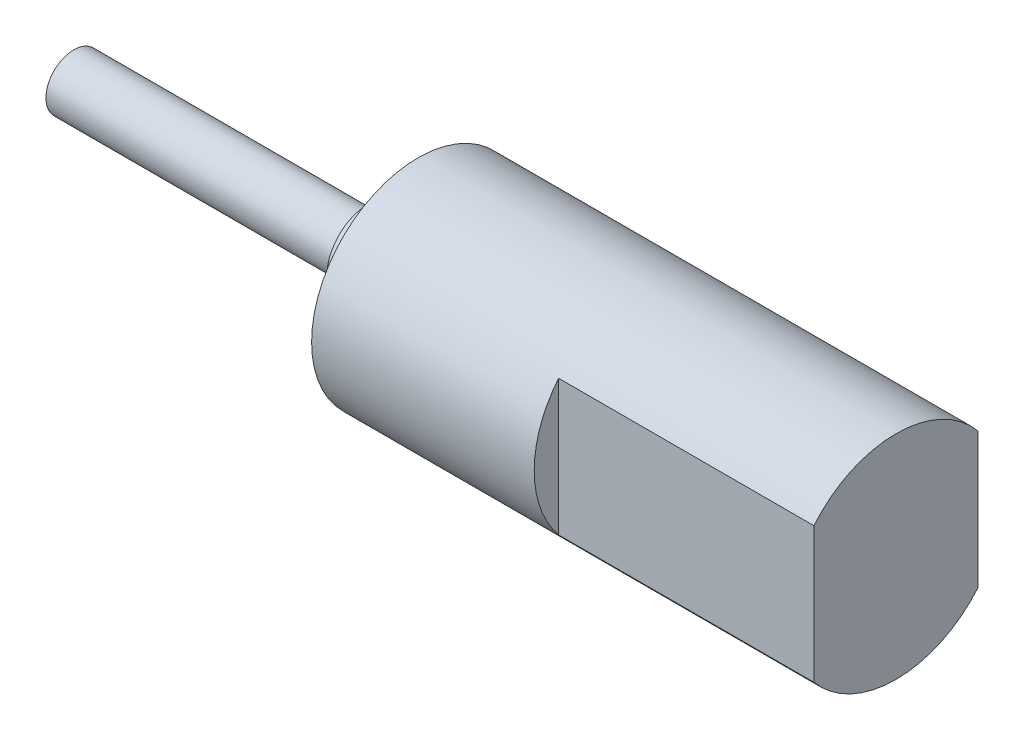
ISO-10303-21;
HEADER;
FILE_DESCRIPTION(('STEP AP214'),'2;1');
FILE_NAME('part.step','',(''),(''),'','','');
FILE_SCHEMA(('AUTOMOTIVE_DESIGN { 1 0 10303 214 1 1 1 1 }'));
ENDSEC;
DATA;
#1=APPLICATION_CONTEXT('core data for automotive mechanical design processes');
#2=APPLICATION_PROTOCOL_DEFINITION('international standard','automotive_design',2000,#1);
#3=PRODUCT_CONTEXT('',#1,'mechanical');
#4=PRODUCT('Part','Part','',(#3));
#5=PRODUCT_RELATED_PRODUCT_CATEGORY('part','',(#4));
#6=PRODUCT_DEFINITION_FORMATION('','',#4);
#7=PRODUCT_DEFINITION_CONTEXT('part definition',#1,'design');
#8=PRODUCT_DEFINITION('design','',#6,#7);
#9=PRODUCT_DEFINITION_SHAPE('','',#8);
#10=(LENGTH_UNIT() NAMED_UNIT(*) SI_UNIT(.MILLI.,.METRE.));
#11=(NAMED_UNIT(*) PLANE_ANGLE_UNIT() SI_UNIT($,.RADIAN.));
#12=(NAMED_UNIT(*) SI_UNIT($,.STERADIAN.) SOLID_ANGLE_UNIT());
#13=UNCERTAINTY_MEASURE_WITH_UNIT(LENGTH_MEASURE(1.E-05),#10,'distance_accuracy_value','');
#14=(GEOMETRIC_REPRESENTATION_CONTEXT(3) GLOBAL_UNCERTAINTY_ASSIGNED_CONTEXT((#13)) GLOBAL_UNIT_ASSIGNED_CONTEXT((#10,
#11,#12)) REPRESENTATION_CONTEXT('',''));
#15=CARTESIAN_POINT('',(0.,0.,0.));
#16=DIRECTION('',(0.,0.,1.));
#17=DIRECTION('',(1.,0.,0.));
#18=AXIS2_PLACEMENT_3D('',#15,#16,#17);
#19=CARTESIAN_POINT('',(-40.77,0.,0.));
#20=DIRECTION('',(1.,0.,0.));
#21=DIRECTION('',(0.,0.,-1.));
#22=AXIS2_PLACEMENT_3D('',#19,#20,#21);
#23=CYLINDRICAL_SURFACE('',#22,2.);
#24=DIRECTION('',(-1.,0.,0.));
#25=VECTOR('',#24,1.);
#26=CARTESIAN_POINT('',(-19.57,1.3228756555323,-1.5));
#27=LINE('',#26,#25);
#28=CARTESIAN_POINT('',(-19.57,1.3228756555323,-1.5));
#29=VERTEX_POINT('',#28);
#30=CARTESIAN_POINT('',(-40.77,1.3228756555323,-1.5));
#31=VERTEX_POINT('',#30);
#32=EDGE_CURVE('E161',#29,#31,#27,.T.);
#33=ORIENTED_EDGE('',*,*,#32,.T.);
#34=CARTESIAN_POINT('',(-40.77,0.,0.));
#35=DIRECTION('',(-1.,0.,0.));
#36=DIRECTION('',(0.,0.,1.));
#37=AXIS2_PLACEMENT_3D('',#34,#35,#36);
#38=CIRCLE('',#37,2.);
#39=CARTESIAN_POINT('',(-40.77,-1.3228756555323,-1.5));
#40=VERTEX_POINT('',#39);
#41=EDGE_CURVE('E156',#40,#31,#38,.T.);
#42=ORIENTED_EDGE('',*,*,#41,.F.);
#43=DIRECTION('',(-1.,0.,0.));
#44=VECTOR('',#43,1.);
#45=CARTESIAN_POINT('',(-19.57,-1.3228756555323,-1.5));
#46=LINE('',#45,#44);
#47=CARTESIAN_POINT('',(-19.57,-1.3228756555323,-1.5));
#48=VERTEX_POINT('',#47);
#49=EDGE_CURVE('E65',#48,#40,#46,.T.);
#50=ORIENTED_EDGE('',*,*,#49,.F.);
#51=CARTESIAN_POINT('',(-19.57,0.,0.));
#52=DIRECTION('',(-1.,0.,0.));
#53=DIRECTION('',(0.,0.,1.));
#54=AXIS2_PLACEMENT_3D('',#51,#52,#53);
#55=CIRCLE('',#54,2.);
#56=EDGE_CURVE('E11',#48,#29,#55,.T.);
#57=ORIENTED_EDGE('',*,*,#56,.T.);
#58=EDGE_LOOP('',(#33,#42,#50,#57));
#59=FACE_BOUND('',#58,.T.);
#60=ADVANCED_FACE('F47',(#59),#23,.T.);
#61=CARTESIAN_POINT('',(-40.77,0.,0.));
#62=DIRECTION('',(-1.,0.,0.));
#63=DIRECTION('',(0.,0.,1.));
#64=AXIS2_PLACEMENT_3D('',#61,#62,#63);
#65=PLANE('',#64);
#66=ORIENTED_EDGE('',*,*,#41,.T.);
#67=DIRECTION('',(0.,-1.,0.));
#68=VECTOR('',#67,1.);
#69=CARTESIAN_POINT('',(-40.77,0.,-1.5));
#70=LINE('',#69,#68);
#71=EDGE_CURVE('E168',#31,#40,#70,.T.);
#72=ORIENTED_EDGE('',*,*,#71,.T.);
#73=EDGE_LOOP('',(#66,#72));
#74=FACE_BOUND('',#73,.T.);
#75=ADVANCED_FACE('F210',(#74),#65,.T.);
#76=CARTESIAN_POINT('',(18.36,0.,-5.9));
#77=DIRECTION('',(0.,0.,1.));
#78=DIRECTION('',(1.,0.,0.));
#79=AXIS2_PLACEMENT_3D('',#76,#77,#78);
#80=PLANE('',#79);
#81=DIRECTION('',(0.,1.,0.));
#82=VECTOR('',#81,1.);
#83=CARTESIAN_POINT('',(0.,0.,-5.9));
#84=LINE('',#83,#82);
#85=CARTESIAN_POINT('',(0.,-4.87739940952143,-5.9));
#86=VERTEX_POINT('',#85);
#87=CARTESIAN_POINT('',(0.,4.87739940952143,-5.9));
#88=VERTEX_POINT('',#87);
#89=EDGE_CURVE('E95',#86,#88,#84,.T.);
#90=ORIENTED_EDGE('',*,*,#89,.T.);
#91=DIRECTION('',(-1.,0.,0.));
#92=VECTOR('',#91,1.);
#93=CARTESIAN_POINT('',(18.36,4.87739940952143,-5.9));
#94=LINE('',#93,#92);
#95=CARTESIAN_POINT('',(18.36,4.87739940952143,-5.9));
#96=VERTEX_POINT('',#95);
#97=EDGE_CURVE('E51',#96,#88,#94,.T.);
#98=ORIENTED_EDGE('',*,*,#97,.F.);
#99=DIRECTION('',(0.,1.,0.));
#100=VECTOR('',#99,1.);
#101=CARTESIAN_POINT('',(18.36,0.,-5.9));
#102=LINE('',#101,#100);
#103=CARTESIAN_POINT('',(18.36,-4.87739940952143,-5.9));
#104=VERTEX_POINT('',#103);
#105=EDGE_CURVE('E109',#104,#96,#102,.T.);
#106=ORIENTED_EDGE('',*,*,#105,.F.);
#107=DIRECTION('',(-1.,0.,0.));
#108=VECTOR('',#107,1.);
#109=CARTESIAN_POINT('',(18.36,-4.87739940952143,-5.9));
#110=LINE('',#109,#108);
#111=EDGE_CURVE('E127',#104,#86,#110,.T.);
#112=ORIENTED_EDGE('',*,*,#111,.T.);
#113=EDGE_LOOP('',(#90,#98,#106,#112));
#114=FACE_BOUND('',#113,.T.);
#115=ADVANCED_FACE('F49',(#114),#80,.F.);
#116=CARTESIAN_POINT('',(18.36,0.,5.9));
#117=DIRECTION('',(0.,0.,-1.));
#118=DIRECTION('',(-1.,0.,0.));
#119=AXIS2_PLACEMENT_3D('',#116,#117,#118);
#120=PLANE('',#119);
#121=DIRECTION('',(0.,-1.,0.));
#122=VECTOR('',#121,1.);
#123=CARTESIAN_POINT('',(0.,0.,5.9));
#124=LINE('',#123,#122);
#125=CARTESIAN_POINT('',(0.,4.87739940952143,5.9));
#126=VERTEX_POINT('',#125);
#127=CARTESIAN_POINT('',(0.,-4.87739940952143,5.9));
#128=VERTEX_POINT('',#127);
#129=EDGE_CURVE('E133',#126,#128,#124,.T.);
#130=ORIENTED_EDGE('',*,*,#129,.T.);
#131=DIRECTION('',(-1.,0.,0.));
#132=VECTOR('',#131,1.);
#133=CARTESIAN_POINT('',(18.36,-4.87739940952143,5.9));
#134=LINE('',#133,#132);
#135=CARTESIAN_POINT('',(18.36,-4.87739940952143,5.9));
#136=VERTEX_POINT('',#135);
#137=EDGE_CURVE('E122',#136,#128,#134,.T.);
#138=ORIENTED_EDGE('',*,*,#137,.F.);
#139=DIRECTION('',(0.,-1.,0.));
#140=VECTOR('',#139,1.);
#141=CARTESIAN_POINT('',(18.36,0.,5.9));
#142=LINE('',#141,#140);
#143=CARTESIAN_POINT('',(18.36,4.87739940952143,5.9));
#144=VERTEX_POINT('',#143);
#145=EDGE_CURVE('E106',#144,#136,#142,.T.);
#146=ORIENTED_EDGE('',*,*,#145,.F.);
#147=DIRECTION('',(-1.,0.,0.));
#148=VECTOR('',#147,1.);
#149=CARTESIAN_POINT('',(18.36,4.87739940952143,5.9));
#150=LINE('',#149,#148);
#151=EDGE_CURVE('E116',#144,#126,#150,.T.);
#152=ORIENTED_EDGE('',*,*,#151,.T.);
#153=EDGE_LOOP('',(#130,#138,#146,#152));
#154=FACE_BOUND('',#153,.T.);
#155=ADVANCED_FACE('F123',(#154),#120,.F.);
#156=CARTESIAN_POINT('',(18.36,0.,0.));
#157=DIRECTION('',(-1.,0.,0.));
#158=DIRECTION('',(0.,0.,1.));
#159=AXIS2_PLACEMENT_3D('',#156,#157,#158);
#160=CYLINDRICAL_SURFACE('',#159,7.655);
#161=ORIENTED_EDGE('',*,*,#137,.T.);
#162=CARTESIAN_POINT('',(0.,0.,0.));
#163=DIRECTION('',(-1.,0.,0.));
#164=DIRECTION('',(0.,0.,1.));
#165=AXIS2_PLACEMENT_3D('',#162,#163,#164);
#166=CIRCLE('',#165,7.655);
#167=EDGE_CURVE('E86',#128,#126,#166,.T.);
#168=ORIENTED_EDGE('',*,*,#167,.T.);
#169=ORIENTED_EDGE('',*,*,#151,.F.);
#170=CARTESIAN_POINT('',(18.36,0.,0.));
#171=DIRECTION('',(1.,0.,0.));
#172=DIRECTION('',(0.,0.,-1.));
#173=AXIS2_PLACEMENT_3D('',#170,#171,#172);
#174=CIRCLE('',#173,7.655);
#175=EDGE_CURVE('E102',#96,#144,#174,.T.);
#176=ORIENTED_EDGE('',*,*,#175,.F.);
#177=ORIENTED_EDGE('',*,*,#97,.T.);
#178=EDGE_CURVE('E141',#88,#86,#166,.T.);
#179=ORIENTED_EDGE('',*,*,#178,.T.);
#180=ORIENTED_EDGE('',*,*,#111,.F.);
#181=CARTESIAN_POINT('',(18.36,0.,0.));
#182=DIRECTION('',(1.,0.,0.));
#183=DIRECTION('',(0.,0.,-1.));
#184=AXIS2_PLACEMENT_3D('',#181,#182,#183);
#185=CIRCLE('',#184,7.655);
#186=EDGE_CURVE('E74',#136,#104,#185,.T.);
#187=ORIENTED_EDGE('',*,*,#186,.F.);
#188=EDGE_LOOP('',(#161,#168,#169,#176,#177,#179,#180,#187));
#189=FACE_BOUND('',#188,.T.);
#190=CARTESIAN_POINT('',(-16.01,0.,0.));
#191=DIRECTION('',(-1.,0.,0.));
#192=DIRECTION('',(0.,0.,1.));
#193=AXIS2_PLACEMENT_3D('',#190,#191,#192);
#194=CIRCLE('',#193,7.655);
#195=CARTESIAN_POINT('',(-16.01,0.,7.655));
#196=VERTEX_POINT('',#195);
#197=EDGE_CURVE('E134',#196,#196,#194,.T.);
#198=ORIENTED_EDGE('',*,*,#197,.F.);
#199=EDGE_LOOP('',(#198));
#200=FACE_BOUND('',#199,.T.);
#201=ADVANCED_FACE('F118',(#189,#200),#160,.T.);
#202=CARTESIAN_POINT('',(18.36,0.,0.));
#203=DIRECTION('',(1.,0.,0.));
#204=DIRECTION('',(0.,0.,-1.));
#205=AXIS2_PLACEMENT_3D('',#202,#203,#204);
#206=PLANE('',#205);
#207=ORIENTED_EDGE('',*,*,#105,.T.);
#208=ORIENTED_EDGE('',*,*,#175,.T.);
#209=ORIENTED_EDGE('',*,*,#145,.T.);
#210=ORIENTED_EDGE('',*,*,#186,.T.);
#211=EDGE_LOOP('',(#207,#208,#209,#210));
#212=FACE_BOUND('',#211,.T.);
#213=ADVANCED_FACE('F104',(#212),#206,.T.);
#214=CARTESIAN_POINT('',(0.,0.,0.));
#215=DIRECTION('',(-1.,0.,0.));
#216=DIRECTION('',(0.,0.,1.));
#217=AXIS2_PLACEMENT_3D('',#214,#215,#216);
#218=PLANE('',#217);
#219=ORIENTED_EDGE('',*,*,#89,.F.);
#220=ORIENTED_EDGE('',*,*,#178,.F.);
#221=EDGE_LOOP('',(#219,#220));
#222=FACE_BOUND('',#221,.T.);
#223=ADVANCED_FACE('F198',(#222),#218,.F.);
#224=CARTESIAN_POINT('',(-16.01,0.,0.));
#225=DIRECTION('',(-1.,0.,0.));
#226=DIRECTION('',(0.,0.,1.));
#227=AXIS2_PLACEMENT_3D('',#224,#225,#226);
#228=PLANE('',#227);
#229=CARTESIAN_POINT('',(-16.01,0.,0.));
#230=DIRECTION('',(-1.,0.,0.));
#231=DIRECTION('',(0.,0.,1.));
#232=AXIS2_PLACEMENT_3D('',#229,#230,#231);
#233=CIRCLE('',#232,3.005);
#234=CARTESIAN_POINT('',(-16.01,0.,3.005));
#235=VERTEX_POINT('',#234);
#236=EDGE_CURVE('E57',#235,#235,#233,.T.);
#237=ORIENTED_EDGE('',*,*,#236,.F.);
#238=EDGE_LOOP('',(#237));
#239=FACE_BOUND('',#238,.T.);
#240=ORIENTED_EDGE('',*,*,#197,.T.);
#241=EDGE_LOOP('',(#240));
#242=FACE_BOUND('',#241,.T.);
#243=ADVANCED_FACE('F195',(#239,#242),#228,.T.);
#244=ORIENTED_EDGE('',*,*,#129,.F.);
#245=ORIENTED_EDGE('',*,*,#167,.F.);
#246=EDGE_LOOP('',(#244,#245));
#247=FACE_BOUND('',#246,.T.);
#248=ADVANCED_FACE('F191',(#247),#218,.F.);
#249=CARTESIAN_POINT('',(-19.57,0.,0.));
#250=DIRECTION('',(1.,0.,0.));
#251=DIRECTION('',(0.,0.,-1.));
#252=AXIS2_PLACEMENT_3D('',#249,#250,#251);
#253=CYLINDRICAL_SURFACE('',#252,3.005);
#254=CARTESIAN_POINT('',(-19.57,0.,0.));
#255=DIRECTION('',(-1.,0.,0.));
#256=DIRECTION('',(0.,0.,1.));
#257=AXIS2_PLACEMENT_3D('',#254,#255,#256);
#258=CIRCLE('',#257,3.005);
#259=CARTESIAN_POINT('',(-19.57,0.,3.005));
#260=VERTEX_POINT('',#259);
#261=EDGE_CURVE('E147',#260,#260,#258,.T.);
#262=ORIENTED_EDGE('',*,*,#261,.F.);
#263=EDGE_LOOP('',(#262));
#264=FACE_BOUND('',#263,.T.);
#265=ORIENTED_EDGE('',*,*,#236,.T.);
#266=EDGE_LOOP('',(#265));
#267=FACE_BOUND('',#266,.T.);
#268=ADVANCED_FACE('F185',(#264,#267),#253,.T.);
#269=CARTESIAN_POINT('',(-19.57,0.,0.));
#270=DIRECTION('',(-1.,0.,0.));
#271=DIRECTION('',(0.,0.,1.));
#272=AXIS2_PLACEMENT_3D('',#269,#270,#271);
#273=PLANE('',#272);
#274=ORIENTED_EDGE('',*,*,#56,.F.);
#275=DIRECTION('',(0.,-1.,0.));
#276=VECTOR('',#275,1.);
#277=CARTESIAN_POINT('',(-19.57,0.,-1.5));
#278=LINE('',#277,#276);
#279=EDGE_CURVE('E165',#29,#48,#278,.T.);
#280=ORIENTED_EDGE('',*,*,#279,.F.);
#281=EDGE_LOOP('',(#274,#280));
#282=FACE_BOUND('',#281,.T.);
#283=ORIENTED_EDGE('',*,*,#261,.T.);
#284=EDGE_LOOP('',(#283));
#285=FACE_BOUND('',#284,.T.);
#286=ADVANCED_FACE('F182',(#282,#285),#273,.T.);
#287=CARTESIAN_POINT('',(-19.57,0.,-1.5));
#288=DIRECTION('',(0.,0.,-1.));
#289=DIRECTION('',(-1.,0.,0.));
#290=AXIS2_PLACEMENT_3D('',#287,#288,#289);
#291=PLANE('',#290);
#292=ORIENTED_EDGE('',*,*,#71,.F.);
#293=ORIENTED_EDGE('',*,*,#32,.F.);
#294=ORIENTED_EDGE('',*,*,#279,.T.);
#295=ORIENTED_EDGE('',*,*,#49,.T.);
#296=EDGE_LOOP('',(#292,#293,#294,#295));
#297=FACE_BOUND('',#296,.T.);
#298=ADVANCED_FACE('F175',(#297),#291,.T.);
#299=CLOSED_SHELL('',(#60,#75,#115,#155,#201,#213,#223,#243,#248,#268,#286,#298));
#300=MANIFOLD_SOLID_BREP('B2',#299);
#301=ADVANCED_BREP_SHAPE_REPRESENTATION('',(#18,#300),#14);
#302=SHAPE_DEFINITION_REPRESENTATION(#9,#301);
ENDSEC;
END-ISO-10303-21;
